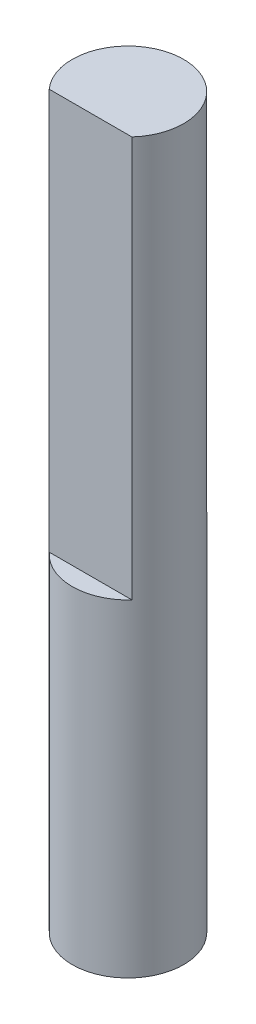
ISO-10303-21;
HEADER;
FILE_DESCRIPTION(('STEP AP214'),'2;1');
FILE_NAME('part.step','',(''),(''),'','','');
FILE_SCHEMA(('AUTOMOTIVE_DESIGN { 1 0 10303 214 1 1 1 1 }'));
ENDSEC;
DATA;
#1=APPLICATION_CONTEXT('core data for automotive mechanical design processes');
#2=APPLICATION_PROTOCOL_DEFINITION('international standard','automotive_design',2000,#1);
#3=PRODUCT_CONTEXT('',#1,'mechanical');
#4=PRODUCT('Part','Part','',(#3));
#5=PRODUCT_RELATED_PRODUCT_CATEGORY('part','',(#4));
#6=PRODUCT_DEFINITION_FORMATION('','',#4);
#7=PRODUCT_DEFINITION_CONTEXT('part definition',#1,'design');
#8=PRODUCT_DEFINITION('design','',#6,#7);
#9=PRODUCT_DEFINITION_SHAPE('','',#8);
#10=(LENGTH_UNIT() NAMED_UNIT(*) SI_UNIT(.MILLI.,.METRE.));
#11=(NAMED_UNIT(*) PLANE_ANGLE_UNIT() SI_UNIT($,.RADIAN.));
#12=(NAMED_UNIT(*) SI_UNIT($,.STERADIAN.) SOLID_ANGLE_UNIT());
#13=UNCERTAINTY_MEASURE_WITH_UNIT(LENGTH_MEASURE(1.E-05),#10,'distance_accuracy_value','');
#14=(GEOMETRIC_REPRESENTATION_CONTEXT(3) GLOBAL_UNCERTAINTY_ASSIGNED_CONTEXT((#13)) GLOBAL_UNIT_ASSIGNED_CONTEXT((#10,
#11,#12)) REPRESENTATION_CONTEXT('',''));
#15=CARTESIAN_POINT('',(0.,0.,0.));
#16=DIRECTION('',(0.,0.,1.));
#17=DIRECTION('',(1.,0.,0.));
#18=AXIS2_PLACEMENT_3D('',#15,#16,#17);
#19=CARTESIAN_POINT('',(0.,14.7,0.));
#20=DIRECTION('',(0.,-1.,0.));
#21=DIRECTION('',(0.,0.,-1.));
#22=AXIS2_PLACEMENT_3D('',#19,#20,#21);
#23=CYLINDRICAL_SURFACE('',#22,2.5019);
#24=CARTESIAN_POINT('',(0.,14.7,0.));
#25=DIRECTION('',(0.,1.,0.));
#26=DIRECTION('',(0.,0.,1.));
#27=AXIS2_PLACEMENT_3D('',#24,#25,#26);
#28=CIRCLE('',#27,2.5019);
#29=CARTESIAN_POINT('',(-1.85548836095691,14.7,1.67829274930015));
#30=VERTEX_POINT('',#29);
#31=CARTESIAN_POINT('',(1.85548836095691,14.7,1.67829274930015));
#32=VERTEX_POINT('',#31);
#33=EDGE_CURVE('E11',#30,#32,#28,.T.);
#34=ORIENTED_EDGE('',*,*,#33,.F.);
#35=DIRECTION('',(0.,-1.,0.));
#36=VECTOR('',#35,1.);
#37=CARTESIAN_POINT('',(-1.85548836095691,32.7,1.67829274930015));
#38=LINE('',#37,#36);
#39=CARTESIAN_POINT('',(-1.85548836095691,32.7,1.67829274930015));
#40=VERTEX_POINT('',#39);
#41=EDGE_CURVE('E79',#40,#30,#38,.T.);
#42=ORIENTED_EDGE('',*,*,#41,.F.);
#43=CARTESIAN_POINT('',(0.,32.7,0.));
#44=DIRECTION('',(0.,1.,0.));
#45=DIRECTION('',(0.,0.,1.));
#46=AXIS2_PLACEMENT_3D('',#43,#44,#45);
#47=CIRCLE('',#46,2.5019);
#48=CARTESIAN_POINT('',(1.85548836095691,32.7,1.67829274930015));
#49=VERTEX_POINT('',#48);
#50=EDGE_CURVE('E81',#49,#40,#47,.T.);
#51=ORIENTED_EDGE('',*,*,#50,.F.);
#52=DIRECTION('',(0.,-1.,0.));
#53=VECTOR('',#52,1.);
#54=CARTESIAN_POINT('',(1.85548836095691,32.7,1.67829274930015));
#55=LINE('',#54,#53);
#56=EDGE_CURVE('E77',#49,#32,#55,.T.);
#57=ORIENTED_EDGE('',*,*,#56,.T.);
#58=EDGE_LOOP('',(#34,#42,#51,#57));
#59=FACE_BOUND('',#58,.T.);
#60=CARTESIAN_POINT('',(0.,0.,0.));
#61=DIRECTION('',(0.,1.,0.));
#62=DIRECTION('',(0.,0.,1.));
#63=AXIS2_PLACEMENT_3D('',#60,#61,#62);
#64=CIRCLE('',#63,2.5019);
#65=CARTESIAN_POINT('',(0.,0.,2.5019));
#66=VERTEX_POINT('',#65);
#67=EDGE_CURVE('E48',#66,#66,#64,.T.);
#68=ORIENTED_EDGE('',*,*,#67,.T.);
#69=EDGE_LOOP('',(#68));
#70=FACE_BOUND('',#69,.T.);
#71=ADVANCED_FACE('F45',(#59,#70),#23,.T.);
#72=CARTESIAN_POINT('',(0.,14.7,0.));
#73=DIRECTION('',(0.,1.,0.));
#74=DIRECTION('',(0.,0.,1.));
#75=AXIS2_PLACEMENT_3D('',#72,#73,#74);
#76=PLANE('',#75);
#77=DIRECTION('',(1.,0.,0.));
#78=VECTOR('',#77,1.);
#79=CARTESIAN_POINT('',(-1.85548836095691,14.7,1.67829274930015));
#80=LINE('',#79,#78);
#81=EDGE_CURVE('E58',#30,#32,#80,.T.);
#82=ORIENTED_EDGE('',*,*,#81,.F.);
#83=ORIENTED_EDGE('',*,*,#33,.T.);
#84=EDGE_LOOP('',(#82,#83));
#85=FACE_BOUND('',#84,.T.);
#86=ADVANCED_FACE('F70',(#85),#76,.T.);
#87=CARTESIAN_POINT('',(0.,0.,0.));
#88=DIRECTION('',(0.,1.,0.));
#89=DIRECTION('',(0.,0.,1.));
#90=AXIS2_PLACEMENT_3D('',#87,#88,#89);
#91=PLANE('',#90);
#92=ORIENTED_EDGE('',*,*,#67,.F.);
#93=EDGE_LOOP('',(#92));
#94=FACE_BOUND('',#93,.T.);
#95=ADVANCED_FACE('F98',(#94),#91,.F.);
#96=CARTESIAN_POINT('',(-1.85548836095691,32.7,1.67829274930015));
#97=DIRECTION('',(0.,0.,-1.));
#98=DIRECTION('',(-1.,0.,0.));
#99=AXIS2_PLACEMENT_3D('',#96,#97,#98);
#100=PLANE('',#99);
#101=ORIENTED_EDGE('',*,*,#81,.T.);
#102=ORIENTED_EDGE('',*,*,#56,.F.);
#103=DIRECTION('',(1.,0.,0.));
#104=VECTOR('',#103,1.);
#105=CARTESIAN_POINT('',(-1.85548836095691,32.7,1.67829274930015));
#106=LINE('',#105,#104);
#107=EDGE_CURVE('E66',#40,#49,#106,.T.);
#108=ORIENTED_EDGE('',*,*,#107,.F.);
#109=ORIENTED_EDGE('',*,*,#41,.T.);
#110=EDGE_LOOP('',(#101,#102,#108,#109));
#111=FACE_BOUND('',#110,.T.);
#112=ADVANCED_FACE('F76',(#111),#100,.F.);
#113=CARTESIAN_POINT('',(0.,32.7,0.));
#114=DIRECTION('',(0.,1.,0.));
#115=DIRECTION('',(0.,0.,1.));
#116=AXIS2_PLACEMENT_3D('',#113,#114,#115);
#117=PLANE('',#116);
#118=ORIENTED_EDGE('',*,*,#50,.T.);
#119=ORIENTED_EDGE('',*,*,#107,.T.);
#120=EDGE_LOOP('',(#118,#119));
#121=FACE_BOUND('',#120,.T.);
#122=ADVANCED_FACE('F92',(#121),#117,.T.);
#123=CLOSED_SHELL('',(#71,#86,#95,#112,#122));
#124=MANIFOLD_SOLID_BREP('B2',#123);
#125=ADVANCED_BREP_SHAPE_REPRESENTATION('',(#18,#124),#14);
#126=SHAPE_DEFINITION_REPRESENTATION(#9,#125);
ENDSEC;
END-ISO-10303-21;
